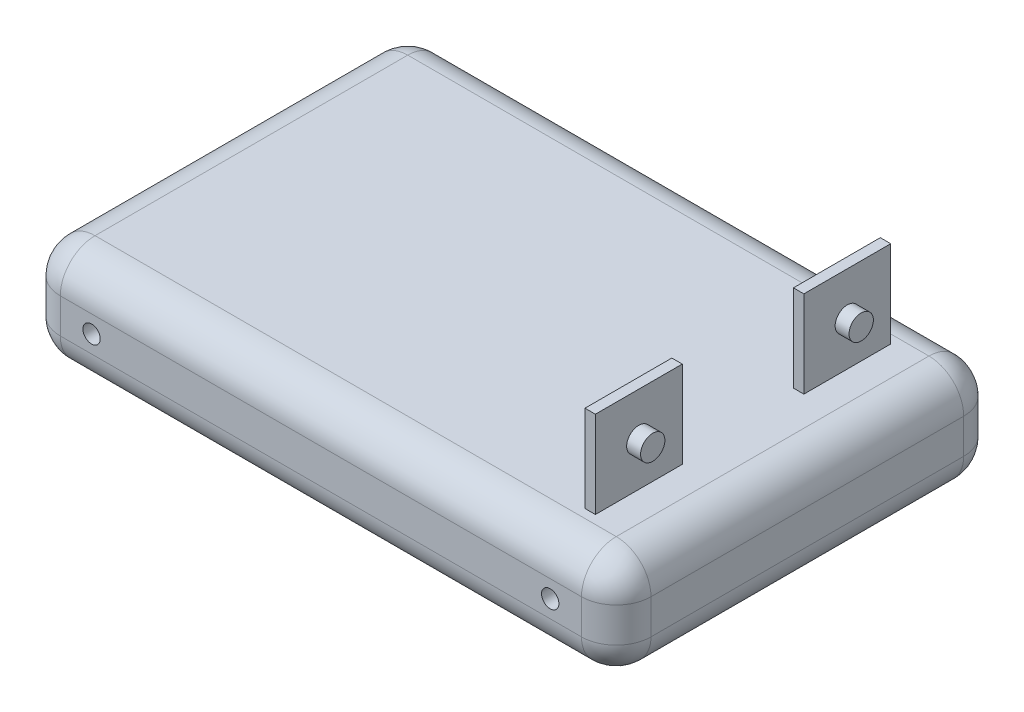
ISO-10303-21;
HEADER;
FILE_DESCRIPTION(('STEP AP214'),'2;1');
FILE_NAME('part.step','',(''),(''),'','','');
FILE_SCHEMA(('AUTOMOTIVE_DESIGN { 1 0 10303 214 1 1 1 1 }'));
ENDSEC;
DATA;
#1=APPLICATION_CONTEXT('core data for automotive mechanical design processes');
#2=APPLICATION_PROTOCOL_DEFINITION('international standard','automotive_design',2000,#1);
#3=PRODUCT_CONTEXT('',#1,'mechanical');
#4=PRODUCT('Part','Part','',(#3));
#5=PRODUCT_RELATED_PRODUCT_CATEGORY('part','',(#4));
#6=PRODUCT_DEFINITION_FORMATION('','',#4);
#7=PRODUCT_DEFINITION_CONTEXT('part definition',#1,'design');
#8=PRODUCT_DEFINITION('design','',#6,#7);
#9=PRODUCT_DEFINITION_SHAPE('','',#8);
#10=(LENGTH_UNIT() NAMED_UNIT(*) SI_UNIT(.MILLI.,.METRE.));
#11=(NAMED_UNIT(*) PLANE_ANGLE_UNIT() SI_UNIT($,.RADIAN.));
#12=(NAMED_UNIT(*) SI_UNIT($,.STERADIAN.) SOLID_ANGLE_UNIT());
#13=UNCERTAINTY_MEASURE_WITH_UNIT(LENGTH_MEASURE(1.E-05),#10,'distance_accuracy_value','');
#14=(GEOMETRIC_REPRESENTATION_CONTEXT(3) GLOBAL_UNCERTAINTY_ASSIGNED_CONTEXT((#13)) GLOBAL_UNIT_ASSIGNED_CONTEXT((#10,
#11,#12)) REPRESENTATION_CONTEXT('',''));
#15=CARTESIAN_POINT('',(0.,0.,0.));
#16=DIRECTION('',(0.,0.,1.));
#17=DIRECTION('',(1.,0.,0.));
#18=AXIS2_PLACEMENT_3D('',#15,#16,#17);
#19=CARTESIAN_POINT('',(0.,30.,0.));
#20=DIRECTION('',(0.,1.,0.));
#21=DIRECTION('',(0.,0.,1.));
#22=AXIS2_PLACEMENT_3D('',#19,#20,#21);
#23=PLANE('',#22);
#24=DIRECTION('',(1.,0.,0.));
#25=VECTOR('',#24,1.);
#26=CARTESIAN_POINT('',(85.,30.,45.));
#27=LINE('',#26,#25);
#28=CARTESIAN_POINT('',(-75.,30.,45.));
#29=VERTEX_POINT('',#28);
#30=CARTESIAN_POINT('',(75.,30.,45.));
#31=VERTEX_POINT('',#30);
#32=EDGE_CURVE('E273',#29,#31,#27,.T.);
#33=ORIENTED_EDGE('',*,*,#32,.T.);
#34=DIRECTION('',(0.,0.,-1.));
#35=VECTOR('',#34,1.);
#36=CARTESIAN_POINT('',(75.,30.,-55.));
#37=LINE('',#36,#35);
#38=CARTESIAN_POINT('',(75.,30.,-45.));
#39=VERTEX_POINT('',#38);
#40=EDGE_CURVE('E310',#31,#39,#37,.T.);
#41=ORIENTED_EDGE('',*,*,#40,.T.);
#42=DIRECTION('',(-1.,0.,0.));
#43=VECTOR('',#42,1.);
#44=CARTESIAN_POINT('',(-75.,30.,-45.));
#45=LINE('',#44,#43);
#46=CARTESIAN_POINT('',(-75.,30.,-45.));
#47=VERTEX_POINT('',#46);
#48=EDGE_CURVE('E308',#39,#47,#45,.T.);
#49=ORIENTED_EDGE('',*,*,#48,.T.);
#50=DIRECTION('',(0.,0.,1.));
#51=VECTOR('',#50,1.);
#52=CARTESIAN_POINT('',(-75.,30.,55.));
#53=LINE('',#52,#51);
#54=EDGE_CURVE('E271',#47,#29,#53,.T.);
#55=ORIENTED_EDGE('',*,*,#54,.T.);
#56=EDGE_LOOP('',(#33,#41,#49,#55));
#57=FACE_BOUND('',#56,.T.);
#58=DIRECTION('',(-1.,0.,0.));
#59=VECTOR('',#58,1.);
#60=CARTESIAN_POINT('',(63.5,30.,-42.5000000000001));
#61=LINE('',#60,#59);
#62=CARTESIAN_POINT('',(66.5,30.,-42.5000000000001));
#63=VERTEX_POINT('',#62);
#64=CARTESIAN_POINT('',(63.5,30.,-42.5000000000001));
#65=VERTEX_POINT('',#64);
#66=EDGE_CURVE('E201',#63,#65,#61,.T.);
#67=ORIENTED_EDGE('',*,*,#66,.F.);
#68=DIRECTION('',(0.,0.,-1.));
#69=VECTOR('',#68,1.);
#70=CARTESIAN_POINT('',(66.5,30.,-42.5000000000001));
#71=LINE('',#70,#69);
#72=CARTESIAN_POINT('',(66.5,30.,-17.5000000000001));
#73=VERTEX_POINT('',#72);
#74=EDGE_CURVE('E198',#73,#63,#71,.T.);
#75=ORIENTED_EDGE('',*,*,#74,.F.);
#76=DIRECTION('',(1.,0.,0.));
#77=VECTOR('',#76,1.);
#78=CARTESIAN_POINT('',(63.5,30.,-17.5000000000001));
#79=LINE('',#78,#77);
#80=CARTESIAN_POINT('',(63.5,30.,-17.5000000000001));
#81=VERTEX_POINT('',#80);
#82=EDGE_CURVE('E210',#81,#73,#79,.T.);
#83=ORIENTED_EDGE('',*,*,#82,.F.);
#84=DIRECTION('',(0.,0.,1.));
#85=VECTOR('',#84,1.);
#86=CARTESIAN_POINT('',(63.5,30.,-42.5000000000001));
#87=LINE('',#86,#85);
#88=EDGE_CURVE('E218',#65,#81,#87,.T.);
#89=ORIENTED_EDGE('',*,*,#88,.F.);
#90=EDGE_LOOP('',(#67,#75,#83,#89));
#91=FACE_BOUND('',#90,.T.);
#92=DIRECTION('',(-1.,0.,0.));
#93=VECTOR('',#92,1.);
#94=CARTESIAN_POINT('',(63.5,30.,17.5));
#95=LINE('',#94,#93);
#96=CARTESIAN_POINT('',(66.5,30.,17.5));
#97=VERTEX_POINT('',#96);
#98=CARTESIAN_POINT('',(63.5,30.,17.5));
#99=VERTEX_POINT('',#98);
#100=EDGE_CURVE('E901',#97,#99,#95,.T.);
#101=ORIENTED_EDGE('',*,*,#100,.F.);
#102=DIRECTION('',(0.,0.,-1.));
#103=VECTOR('',#102,1.);
#104=CARTESIAN_POINT('',(66.5,30.,42.5));
#105=LINE('',#104,#103);
#106=CARTESIAN_POINT('',(66.5,30.,42.5));
#107=VERTEX_POINT('',#106);
#108=EDGE_CURVE('E196',#107,#97,#105,.T.);
#109=ORIENTED_EDGE('',*,*,#108,.F.);
#110=DIRECTION('',(1.,0.,0.));
#111=VECTOR('',#110,1.);
#112=CARTESIAN_POINT('',(63.5,30.,42.5));
#113=LINE('',#112,#111);
#114=CARTESIAN_POINT('',(63.5,30.,42.5));
#115=VERTEX_POINT('',#114);
#116=EDGE_CURVE('E192',#115,#107,#113,.T.);
#117=ORIENTED_EDGE('',*,*,#116,.F.);
#118=DIRECTION('',(0.,0.,1.));
#119=VECTOR('',#118,1.);
#120=CARTESIAN_POINT('',(63.5,30.,42.5));
#121=LINE('',#120,#119);
#122=EDGE_CURVE('E903',#99,#115,#121,.T.);
#123=ORIENTED_EDGE('',*,*,#122,.F.);
#124=EDGE_LOOP('',(#101,#109,#117,#123));
#125=FACE_BOUND('',#124,.T.);
#126=ADVANCED_FACE('F35',(#57,#91,#125),#23,.T.);
#127=CARTESIAN_POINT('',(85.,30.,-55.));
#128=DIRECTION('',(-1.,0.,0.));
#129=DIRECTION('',(0.,0.,1.));
#130=AXIS2_PLACEMENT_3D('',#127,#128,#129);
#131=PLANE('',#130);
#132=DIRECTION('',(0.,-1.,0.));
#133=VECTOR('',#132,1.);
#134=CARTESIAN_POINT('',(85.,30.,45.));
#135=LINE('',#134,#133);
#136=CARTESIAN_POINT('',(85.,20.,45.));
#137=VERTEX_POINT('',#136);
#138=CARTESIAN_POINT('',(85.,10.,45.));
#139=VERTEX_POINT('',#138);
#140=EDGE_CURVE('E276',#137,#139,#135,.T.);
#141=ORIENTED_EDGE('',*,*,#140,.T.);
#142=DIRECTION('',(0.,0.,-1.));
#143=VECTOR('',#142,1.);
#144=CARTESIAN_POINT('',(85.,10.,-55.));
#145=LINE('',#144,#143);
#146=CARTESIAN_POINT('',(85.,10.,-45.));
#147=VERTEX_POINT('',#146);
#148=EDGE_CURVE('E357',#139,#147,#145,.T.);
#149=ORIENTED_EDGE('',*,*,#148,.T.);
#150=DIRECTION('',(0.,-1.,0.));
#151=VECTOR('',#150,1.);
#152=CARTESIAN_POINT('',(85.,30.,-45.));
#153=LINE('',#152,#151);
#154=CARTESIAN_POINT('',(85.,20.,-45.));
#155=VERTEX_POINT('',#154);
#156=EDGE_CURVE('E312',#147,#155,#153,.F.);
#157=ORIENTED_EDGE('',*,*,#156,.T.);
#158=DIRECTION('',(0.,0.,-1.));
#159=VECTOR('',#158,1.);
#160=CARTESIAN_POINT('',(85.,20.,45.));
#161=LINE('',#160,#159);
#162=EDGE_CURVE('E314',#155,#137,#161,.F.);
#163=ORIENTED_EDGE('',*,*,#162,.T.);
#164=EDGE_LOOP('',(#141,#149,#157,#163));
#165=FACE_BOUND('',#164,.T.);
#166=ADVANCED_FACE('F392',(#165),#131,.F.);
#167=CARTESIAN_POINT('',(-85.,30.,-55.));
#168=DIRECTION('',(0.,0.,1.));
#169=DIRECTION('',(1.,0.,0.));
#170=AXIS2_PLACEMENT_3D('',#167,#168,#169);
#171=PLANE('',#170);
#172=CARTESIAN_POINT('',(66.,15.,-55.));
#173=DIRECTION('',(0.,0.,-1.));
#174=DIRECTION('',(-1.,0.,0.));
#175=AXIS2_PLACEMENT_3D('',#172,#173,#174);
#176=CIRCLE('',#175,2.5);
#177=CARTESIAN_POINT('',(63.5,15.,-55.));
#178=VERTEX_POINT('',#177);
#179=EDGE_CURVE('E246',#178,#178,#176,.T.);
#180=ORIENTED_EDGE('',*,*,#179,.F.);
#181=EDGE_LOOP('',(#180));
#182=FACE_BOUND('',#181,.T.);
#183=CARTESIAN_POINT('',(-66.,15.,-55.));
#184=DIRECTION('',(0.,0.,-1.));
#185=DIRECTION('',(-1.,0.,0.));
#186=AXIS2_PLACEMENT_3D('',#183,#184,#185);
#187=CIRCLE('',#186,2.50000000000001);
#188=CARTESIAN_POINT('',(-68.5,15.,-55.));
#189=VERTEX_POINT('',#188);
#190=EDGE_CURVE('E233',#189,#189,#187,.T.);
#191=ORIENTED_EDGE('',*,*,#190,.F.);
#192=EDGE_LOOP('',(#191));
#193=FACE_BOUND('',#192,.T.);
#194=DIRECTION('',(0.,-1.,0.));
#195=VECTOR('',#194,1.);
#196=CARTESIAN_POINT('',(75.,30.,-55.));
#197=LINE('',#196,#195);
#198=CARTESIAN_POINT('',(75.,20.,-55.));
#199=VERTEX_POINT('',#198);
#200=CARTESIAN_POINT('',(75.,10.,-55.));
#201=VERTEX_POINT('',#200);
#202=EDGE_CURVE('E301',#199,#201,#197,.T.);
#203=ORIENTED_EDGE('',*,*,#202,.T.);
#204=DIRECTION('',(-1.,0.,0.));
#205=VECTOR('',#204,1.);
#206=CARTESIAN_POINT('',(-85.,10.,-55.));
#207=LINE('',#206,#205);
#208=CARTESIAN_POINT('',(-75.,10.,-55.));
#209=VERTEX_POINT('',#208);
#210=EDGE_CURVE('E355',#201,#209,#207,.T.);
#211=ORIENTED_EDGE('',*,*,#210,.T.);
#212=DIRECTION('',(0.,-1.,0.));
#213=VECTOR('',#212,1.);
#214=CARTESIAN_POINT('',(-75.,30.,-55.));
#215=LINE('',#214,#213);
#216=CARTESIAN_POINT('',(-75.,20.,-55.));
#217=VERTEX_POINT('',#216);
#218=EDGE_CURVE('E304',#209,#217,#215,.F.);
#219=ORIENTED_EDGE('',*,*,#218,.T.);
#220=DIRECTION('',(-1.,0.,0.));
#221=VECTOR('',#220,1.);
#222=CARTESIAN_POINT('',(85.,20.,-55.));
#223=LINE('',#222,#221);
#224=EDGE_CURVE('E299',#217,#199,#223,.F.);
#225=ORIENTED_EDGE('',*,*,#224,.T.);
#226=EDGE_LOOP('',(#203,#211,#219,#225));
#227=FACE_BOUND('',#226,.T.);
#228=ADVANCED_FACE('F400',(#182,#193,#227),#171,.F.);
#229=CARTESIAN_POINT('',(-85.,30.,-55.));
#230=DIRECTION('',(1.,0.,0.));
#231=DIRECTION('',(0.,0.,-1.));
#232=AXIS2_PLACEMENT_3D('',#229,#230,#231);
#233=PLANE('',#232);
#234=DIRECTION('',(0.,-1.,0.));
#235=VECTOR('',#234,1.);
#236=CARTESIAN_POINT('',(-85.,30.,-45.));
#237=LINE('',#236,#235);
#238=CARTESIAN_POINT('',(-85.,20.,-45.));
#239=VERTEX_POINT('',#238);
#240=CARTESIAN_POINT('',(-85.,10.,-45.));
#241=VERTEX_POINT('',#240);
#242=EDGE_CURVE('E296',#239,#241,#237,.T.);
#243=ORIENTED_EDGE('',*,*,#242,.T.);
#244=DIRECTION('',(0.,0.,1.));
#245=VECTOR('',#244,1.);
#246=CARTESIAN_POINT('',(-85.,10.,-55.));
#247=LINE('',#246,#245);
#248=CARTESIAN_POINT('',(-85.,10.,45.));
#249=VERTEX_POINT('',#248);
#250=EDGE_CURVE('E343',#241,#249,#247,.T.);
#251=ORIENTED_EDGE('',*,*,#250,.T.);
#252=DIRECTION('',(0.,-1.,0.));
#253=VECTOR('',#252,1.);
#254=CARTESIAN_POINT('',(-85.,30.,45.));
#255=LINE('',#254,#253);
#256=CARTESIAN_POINT('',(-85.,20.,45.));
#257=VERTEX_POINT('',#256);
#258=EDGE_CURVE('E269',#249,#257,#255,.F.);
#259=ORIENTED_EDGE('',*,*,#258,.T.);
#260=DIRECTION('',(0.,0.,1.));
#261=VECTOR('',#260,1.);
#262=CARTESIAN_POINT('',(-85.,20.,-55.));
#263=LINE('',#262,#261);
#264=EDGE_CURVE('E266',#257,#239,#263,.F.);
#265=ORIENTED_EDGE('',*,*,#264,.T.);
#266=EDGE_LOOP('',(#243,#251,#259,#265));
#267=FACE_BOUND('',#266,.T.);
#268=ADVANCED_FACE('F416',(#267),#233,.F.);
#269=CARTESIAN_POINT('',(-85.,30.,55.));
#270=DIRECTION('',(0.,0.,-1.));
#271=DIRECTION('',(-1.,0.,0.));
#272=AXIS2_PLACEMENT_3D('',#269,#270,#271);
#273=PLANE('',#272);
#274=CARTESIAN_POINT('',(-66.,15.,55.));
#275=DIRECTION('',(0.,0.,1.));
#276=DIRECTION('',(1.,0.,0.));
#277=AXIS2_PLACEMENT_3D('',#274,#275,#276);
#278=CIRCLE('',#277,2.50000000000001);
#279=CARTESIAN_POINT('',(-63.5,15.,55.));
#280=VERTEX_POINT('',#279);
#281=EDGE_CURVE('E234',#280,#280,#278,.T.);
#282=ORIENTED_EDGE('',*,*,#281,.F.);
#283=EDGE_LOOP('',(#282));
#284=FACE_BOUND('',#283,.T.);
#285=CARTESIAN_POINT('',(66.,15.,55.));
#286=DIRECTION('',(0.,0.,1.));
#287=DIRECTION('',(1.,0.,0.));
#288=AXIS2_PLACEMENT_3D('',#285,#286,#287);
#289=CIRCLE('',#288,2.5);
#290=CARTESIAN_POINT('',(68.5,15.,55.));
#291=VERTEX_POINT('',#290);
#292=EDGE_CURVE('E229',#291,#291,#289,.T.);
#293=ORIENTED_EDGE('',*,*,#292,.F.);
#294=EDGE_LOOP('',(#293));
#295=FACE_BOUND('',#294,.T.);
#296=DIRECTION('',(1.,0.,0.));
#297=VECTOR('',#296,1.);
#298=CARTESIAN_POINT('',(-85.,20.,55.));
#299=LINE('',#298,#297);
#300=CARTESIAN_POINT('',(75.,20.,55.));
#301=VERTEX_POINT('',#300);
#302=CARTESIAN_POINT('',(-75.,20.,55.));
#303=VERTEX_POINT('',#302);
#304=EDGE_CURVE('E261',#301,#303,#299,.F.);
#305=ORIENTED_EDGE('',*,*,#304,.T.);
#306=DIRECTION('',(0.,-1.,0.));
#307=VECTOR('',#306,1.);
#308=CARTESIAN_POINT('',(-75.,30.,55.));
#309=LINE('',#308,#307);
#310=CARTESIAN_POINT('',(-75.,10.,55.));
#311=VERTEX_POINT('',#310);
#312=EDGE_CURVE('E263',#303,#311,#309,.T.);
#313=ORIENTED_EDGE('',*,*,#312,.T.);
#314=DIRECTION('',(1.,0.,0.));
#315=VECTOR('',#314,1.);
#316=CARTESIAN_POINT('',(-85.,10.,55.));
#317=LINE('',#316,#315);
#318=CARTESIAN_POINT('',(75.,10.,55.));
#319=VERTEX_POINT('',#318);
#320=EDGE_CURVE('E254',#311,#319,#317,.T.);
#321=ORIENTED_EDGE('',*,*,#320,.T.);
#322=DIRECTION('',(0.,-1.,0.));
#323=VECTOR('',#322,1.);
#324=CARTESIAN_POINT('',(75.,30.,55.));
#325=LINE('',#324,#323);
#326=EDGE_CURVE('E257',#319,#301,#325,.F.);
#327=ORIENTED_EDGE('',*,*,#326,.T.);
#328=EDGE_LOOP('',(#305,#313,#321,#327));
#329=FACE_BOUND('',#328,.T.);
#330=ADVANCED_FACE('F412',(#284,#295,#329),#273,.F.);
#331=CARTESIAN_POINT('',(0.,0.,0.));
#332=DIRECTION('',(0.,1.,0.));
#333=DIRECTION('',(0.,0.,1.));
#334=AXIS2_PLACEMENT_3D('',#331,#332,#333);
#335=PLANE('',#334);
#336=DIRECTION('',(1.,0.,0.));
#337=VECTOR('',#336,1.);
#338=CARTESIAN_POINT('',(0.,0.,45.));
#339=LINE('',#338,#337);
#340=CARTESIAN_POINT('',(75.,0.,45.));
#341=VERTEX_POINT('',#340);
#342=CARTESIAN_POINT('',(-75.,0.,45.));
#343=VERTEX_POINT('',#342);
#344=EDGE_CURVE('E279',#341,#343,#339,.F.);
#345=ORIENTED_EDGE('',*,*,#344,.T.);
#346=DIRECTION('',(0.,0.,1.));
#347=VECTOR('',#346,1.);
#348=CARTESIAN_POINT('',(-75.,0.,0.));
#349=LINE('',#348,#347);
#350=CARTESIAN_POINT('',(-75.,0.,-45.));
#351=VERTEX_POINT('',#350);
#352=EDGE_CURVE('E349',#343,#351,#349,.F.);
#353=ORIENTED_EDGE('',*,*,#352,.T.);
#354=DIRECTION('',(-1.,0.,0.));
#355=VECTOR('',#354,1.);
#356=CARTESIAN_POINT('',(0.,0.,-45.));
#357=LINE('',#356,#355);
#358=CARTESIAN_POINT('',(75.,0.,-45.));
#359=VERTEX_POINT('',#358);
#360=EDGE_CURVE('E347',#351,#359,#357,.F.);
#361=ORIENTED_EDGE('',*,*,#360,.T.);
#362=DIRECTION('',(0.,0.,-1.));
#363=VECTOR('',#362,1.);
#364=CARTESIAN_POINT('',(75.,0.,0.));
#365=LINE('',#364,#363);
#366=EDGE_CURVE('E345',#359,#341,#365,.F.);
#367=ORIENTED_EDGE('',*,*,#366,.T.);
#368=EDGE_LOOP('',(#345,#353,#361,#367));
#369=FACE_BOUND('',#368,.T.);
#370=ADVANCED_FACE('F408',(#369),#335,.F.);
#371=CARTESIAN_POINT('',(-75.,20.,0.));
#372=DIRECTION('',(0.,0.,-1.));
#373=DIRECTION('',(-1.,0.,0.));
#374=AXIS2_PLACEMENT_3D('',#371,#372,#373);
#375=CYLINDRICAL_SURFACE('',#374,10.);
#376=ORIENTED_EDGE('',*,*,#54,.F.);
#377=CARTESIAN_POINT('',(-75.,20.,-45.));
#378=DIRECTION('',(0.,0.,-1.));
#379=DIRECTION('',(-1.,0.,0.));
#380=AXIS2_PLACEMENT_3D('',#377,#378,#379);
#381=CIRCLE('',#380,10.);
#382=EDGE_CURVE('E306',#47,#239,#381,.F.);
#383=ORIENTED_EDGE('',*,*,#382,.T.);
#384=ORIENTED_EDGE('',*,*,#264,.F.);
#385=CARTESIAN_POINT('',(-75.,20.,45.));
#386=DIRECTION('',(0.,0.,1.));
#387=DIRECTION('',(1.,0.,0.));
#388=AXIS2_PLACEMENT_3D('',#385,#386,#387);
#389=CIRCLE('',#388,10.);
#390=EDGE_CURVE('E258',#29,#257,#389,.T.);
#391=ORIENTED_EDGE('',*,*,#390,.F.);
#392=EDGE_LOOP('',(#376,#383,#384,#391));
#393=FACE_BOUND('',#392,.T.);
#394=ADVANCED_FACE('F411',(#393),#375,.T.);
#395=CARTESIAN_POINT('',(0.,20.,45.));
#396=DIRECTION('',(-1.,0.,0.));
#397=DIRECTION('',(0.,0.,1.));
#398=AXIS2_PLACEMENT_3D('',#395,#396,#397);
#399=CYLINDRICAL_SURFACE('',#398,10.);
#400=ORIENTED_EDGE('',*,*,#304,.F.);
#401=CARTESIAN_POINT('',(75.,20.,45.));
#402=DIRECTION('',(-1.,0.,0.));
#403=DIRECTION('',(0.,0.,1.));
#404=AXIS2_PLACEMENT_3D('',#401,#402,#403);
#405=CIRCLE('',#404,10.);
#406=EDGE_CURVE('E294',#301,#31,#405,.T.);
#407=ORIENTED_EDGE('',*,*,#406,.T.);
#408=ORIENTED_EDGE('',*,*,#32,.F.);
#409=CARTESIAN_POINT('',(-75.,20.,45.));
#410=DIRECTION('',(-1.,0.,0.));
#411=DIRECTION('',(0.,0.,1.));
#412=AXIS2_PLACEMENT_3D('',#409,#410,#411);
#413=CIRCLE('',#412,10.);
#414=EDGE_CURVE('E286',#303,#29,#413,.T.);
#415=ORIENTED_EDGE('',*,*,#414,.F.);
#416=EDGE_LOOP('',(#400,#407,#408,#415));
#417=FACE_BOUND('',#416,.T.);
#418=ADVANCED_FACE('F440',(#417),#399,.T.);
#419=CARTESIAN_POINT('',(75.,30.,45.));
#420=DIRECTION('',(0.,-1.,0.));
#421=DIRECTION('',(0.,0.,-1.));
#422=AXIS2_PLACEMENT_3D('',#419,#420,#421);
#423=CYLINDRICAL_SURFACE('',#422,10.);
#424=ORIENTED_EDGE('',*,*,#326,.F.);
#425=CARTESIAN_POINT('',(75.,10.,45.));
#426=DIRECTION('',(0.,-1.,0.));
#427=DIRECTION('',(0.,0.,-1.));
#428=AXIS2_PLACEMENT_3D('',#425,#426,#427);
#429=CIRCLE('',#428,10.);
#430=EDGE_CURVE('E339',#319,#139,#429,.F.);
#431=ORIENTED_EDGE('',*,*,#430,.T.);
#432=ORIENTED_EDGE('',*,*,#140,.F.);
#433=CARTESIAN_POINT('',(75.,20.,45.));
#434=DIRECTION('',(0.,-1.,0.));
#435=DIRECTION('',(0.,0.,-1.));
#436=AXIS2_PLACEMENT_3D('',#433,#434,#435);
#437=CIRCLE('',#436,10.);
#438=EDGE_CURVE('E282',#137,#301,#437,.T.);
#439=ORIENTED_EDGE('',*,*,#438,.T.);
#440=EDGE_LOOP('',(#424,#431,#432,#439));
#441=FACE_BOUND('',#440,.T.);
#442=ADVANCED_FACE('F436',(#441),#423,.T.);
#443=CARTESIAN_POINT('',(-75.,20.,45.));
#444=DIRECTION('',(0.,1.,0.));
#445=DIRECTION('',(0.,0.,1.));
#446=AXIS2_PLACEMENT_3D('',#443,#444,#445);
#447=SPHERICAL_SURFACE('',#446,10.);
#448=ORIENTED_EDGE('',*,*,#414,.T.);
#449=ORIENTED_EDGE('',*,*,#390,.T.);
#450=CARTESIAN_POINT('',(-75.,20.,45.));
#451=DIRECTION('',(0.,1.,0.));
#452=DIRECTION('',(0.,0.,1.));
#453=AXIS2_PLACEMENT_3D('',#450,#451,#452);
#454=CIRCLE('',#453,10.);
#455=EDGE_CURVE('E283',#303,#257,#454,.F.);
#456=ORIENTED_EDGE('',*,*,#455,.F.);
#457=EDGE_LOOP('',(#448,#449,#456));
#458=FACE_BOUND('',#457,.T.);
#459=ADVANCED_FACE('F432',(#458),#447,.T.);
#460=CARTESIAN_POINT('',(-85.,10.,45.));
#461=DIRECTION('',(1.,0.,0.));
#462=DIRECTION('',(0.,0.,-1.));
#463=AXIS2_PLACEMENT_3D('',#460,#461,#462);
#464=CYLINDRICAL_SURFACE('',#463,10.);
#465=ORIENTED_EDGE('',*,*,#344,.F.);
#466=CARTESIAN_POINT('',(75.,10.,45.));
#467=DIRECTION('',(1.,0.,0.));
#468=DIRECTION('',(0.,0.,-1.));
#469=AXIS2_PLACEMENT_3D('',#466,#467,#468);
#470=CIRCLE('',#469,10.);
#471=EDGE_CURVE('E336',#341,#319,#470,.F.);
#472=ORIENTED_EDGE('',*,*,#471,.T.);
#473=ORIENTED_EDGE('',*,*,#320,.F.);
#474=CARTESIAN_POINT('',(-75.,10.,45.));
#475=DIRECTION('',(1.,0.,0.));
#476=DIRECTION('',(0.,0.,-1.));
#477=AXIS2_PLACEMENT_3D('',#474,#475,#476);
#478=CIRCLE('',#477,10.);
#479=EDGE_CURVE('E316',#311,#343,#478,.T.);
#480=ORIENTED_EDGE('',*,*,#479,.T.);
#481=EDGE_LOOP('',(#465,#472,#473,#480));
#482=FACE_BOUND('',#481,.T.);
#483=ADVANCED_FACE('F428',(#482),#464,.T.);
#484=CARTESIAN_POINT('',(-75.,30.,45.));
#485=DIRECTION('',(0.,-1.,0.));
#486=DIRECTION('',(0.,0.,-1.));
#487=AXIS2_PLACEMENT_3D('',#484,#485,#486);
#488=CYLINDRICAL_SURFACE('',#487,10.);
#489=ORIENTED_EDGE('',*,*,#258,.F.);
#490=CARTESIAN_POINT('',(-75.,10.,45.));
#491=DIRECTION('',(0.,-1.,0.));
#492=DIRECTION('',(0.,0.,-1.));
#493=AXIS2_PLACEMENT_3D('',#490,#491,#492);
#494=CIRCLE('',#493,10.);
#495=EDGE_CURVE('E341',#249,#311,#494,.F.);
#496=ORIENTED_EDGE('',*,*,#495,.T.);
#497=ORIENTED_EDGE('',*,*,#312,.F.);
#498=ORIENTED_EDGE('',*,*,#455,.T.);
#499=EDGE_LOOP('',(#489,#496,#497,#498));
#500=FACE_BOUND('',#499,.T.);
#501=ADVANCED_FACE('F424',(#500),#488,.T.);
#502=CARTESIAN_POINT('',(-75.,30.,-45.));
#503=DIRECTION('',(0.,-1.,0.));
#504=DIRECTION('',(0.,0.,-1.));
#505=AXIS2_PLACEMENT_3D('',#502,#503,#504);
#506=CYLINDRICAL_SURFACE('',#505,10.);
#507=ORIENTED_EDGE('',*,*,#218,.F.);
#508=CARTESIAN_POINT('',(-75.,10.,-45.));
#509=DIRECTION('',(0.,-1.,0.));
#510=DIRECTION('',(0.,0.,-1.));
#511=AXIS2_PLACEMENT_3D('',#508,#509,#510);
#512=CIRCLE('',#511,10.);
#513=EDGE_CURVE('E351',#209,#241,#512,.F.);
#514=ORIENTED_EDGE('',*,*,#513,.T.);
#515=ORIENTED_EDGE('',*,*,#242,.F.);
#516=CARTESIAN_POINT('',(-75.,20.,-45.));
#517=DIRECTION('',(0.,1.,0.));
#518=DIRECTION('',(0.,0.,1.));
#519=AXIS2_PLACEMENT_3D('',#516,#517,#518);
#520=CIRCLE('',#519,10.);
#521=EDGE_CURVE('E287',#217,#239,#520,.T.);
#522=ORIENTED_EDGE('',*,*,#521,.F.);
#523=EDGE_LOOP('',(#507,#514,#515,#522));
#524=FACE_BOUND('',#523,.T.);
#525=ADVANCED_FACE('F427',(#524),#506,.T.);
#526=CARTESIAN_POINT('',(-75.,20.,-45.));
#527=DIRECTION('',(0.,0.,1.));
#528=DIRECTION('',(1.,0.,0.));
#529=AXIS2_PLACEMENT_3D('',#526,#527,#528);
#530=SPHERICAL_SURFACE('',#529,10.);
#531=ORIENTED_EDGE('',*,*,#521,.T.);
#532=ORIENTED_EDGE('',*,*,#382,.F.);
#533=CARTESIAN_POINT('',(-75.,20.,-45.));
#534=DIRECTION('',(1.,0.,0.));
#535=DIRECTION('',(0.,0.,-1.));
#536=AXIS2_PLACEMENT_3D('',#533,#534,#535);
#537=CIRCLE('',#536,10.);
#538=EDGE_CURVE('E330',#217,#47,#537,.T.);
#539=ORIENTED_EDGE('',*,*,#538,.F.);
#540=EDGE_LOOP('',(#531,#532,#539));
#541=FACE_BOUND('',#540,.T.);
#542=ADVANCED_FACE('F467',(#541),#530,.T.);
#543=CARTESIAN_POINT('',(0.,20.,-45.));
#544=DIRECTION('',(1.,0.,0.));
#545=DIRECTION('',(0.,0.,-1.));
#546=AXIS2_PLACEMENT_3D('',#543,#544,#545);
#547=CYLINDRICAL_SURFACE('',#546,10.);
#548=ORIENTED_EDGE('',*,*,#538,.T.);
#549=ORIENTED_EDGE('',*,*,#48,.F.);
#550=CARTESIAN_POINT('',(75.,20.,-45.));
#551=DIRECTION('',(1.,0.,0.));
#552=DIRECTION('',(0.,1.,0.));
#553=AXIS2_PLACEMENT_3D('',#550,#551,#552);
#554=CIRCLE('',#553,10.);
#555=EDGE_CURVE('E327',#199,#39,#554,.T.);
#556=ORIENTED_EDGE('',*,*,#555,.F.);
#557=ORIENTED_EDGE('',*,*,#224,.F.);
#558=EDGE_LOOP('',(#548,#549,#556,#557));
#559=FACE_BOUND('',#558,.T.);
#560=ADVANCED_FACE('F463',(#559),#547,.T.);
#561=CARTESIAN_POINT('',(75.,30.,-45.));
#562=DIRECTION('',(0.,-1.,0.));
#563=DIRECTION('',(0.,0.,-1.));
#564=AXIS2_PLACEMENT_3D('',#561,#562,#563);
#565=CYLINDRICAL_SURFACE('',#564,10.);
#566=ORIENTED_EDGE('',*,*,#156,.F.);
#567=CARTESIAN_POINT('',(75.,10.,-45.));
#568=DIRECTION('',(0.,-1.,0.));
#569=DIRECTION('',(0.,0.,-1.));
#570=AXIS2_PLACEMENT_3D('',#567,#568,#569);
#571=CIRCLE('',#570,10.);
#572=EDGE_CURVE('E353',#147,#201,#571,.F.);
#573=ORIENTED_EDGE('',*,*,#572,.T.);
#574=ORIENTED_EDGE('',*,*,#202,.F.);
#575=CARTESIAN_POINT('',(75.,20.,-45.));
#576=DIRECTION('',(0.,1.,0.));
#577=DIRECTION('',(0.,0.,1.));
#578=AXIS2_PLACEMENT_3D('',#575,#576,#577);
#579=CIRCLE('',#578,10.);
#580=EDGE_CURVE('E324',#155,#199,#579,.T.);
#581=ORIENTED_EDGE('',*,*,#580,.F.);
#582=EDGE_LOOP('',(#566,#573,#574,#581));
#583=FACE_BOUND('',#582,.T.);
#584=ADVANCED_FACE('F459',(#583),#565,.T.);
#585=CARTESIAN_POINT('',(75.,20.,-45.));
#586=DIRECTION('',(0.,0.,-1.));
#587=DIRECTION('',(-1.,0.,0.));
#588=AXIS2_PLACEMENT_3D('',#585,#586,#587);
#589=SPHERICAL_SURFACE('',#588,10.);
#590=ORIENTED_EDGE('',*,*,#580,.T.);
#591=ORIENTED_EDGE('',*,*,#555,.T.);
#592=CARTESIAN_POINT('',(75.,20.,-45.));
#593=DIRECTION('',(0.,0.,-1.));
#594=DIRECTION('',(-1.,0.,0.));
#595=AXIS2_PLACEMENT_3D('',#592,#593,#594);
#596=CIRCLE('',#595,10.);
#597=EDGE_CURVE('E320',#155,#39,#596,.F.);
#598=ORIENTED_EDGE('',*,*,#597,.F.);
#599=EDGE_LOOP('',(#590,#591,#598));
#600=FACE_BOUND('',#599,.T.);
#601=ADVANCED_FACE('F455',(#600),#589,.T.);
#602=CARTESIAN_POINT('',(75.,20.,0.));
#603=DIRECTION('',(0.,0.,1.));
#604=DIRECTION('',(1.,0.,0.));
#605=AXIS2_PLACEMENT_3D('',#602,#603,#604);
#606=CYLINDRICAL_SURFACE('',#605,10.);
#607=ORIENTED_EDGE('',*,*,#597,.T.);
#608=ORIENTED_EDGE('',*,*,#40,.F.);
#609=CARTESIAN_POINT('',(75.,20.,45.));
#610=DIRECTION('',(0.,0.,1.));
#611=DIRECTION('',(0.,-1.,0.));
#612=AXIS2_PLACEMENT_3D('',#609,#610,#611);
#613=CIRCLE('',#612,10.);
#614=EDGE_CURVE('E317',#137,#31,#613,.T.);
#615=ORIENTED_EDGE('',*,*,#614,.F.);
#616=ORIENTED_EDGE('',*,*,#162,.F.);
#617=EDGE_LOOP('',(#607,#608,#615,#616));
#618=FACE_BOUND('',#617,.T.);
#619=ADVANCED_FACE('F451',(#618),#606,.T.);
#620=CARTESIAN_POINT('',(75.,20.,45.));
#621=DIRECTION('',(0.,0.,1.));
#622=DIRECTION('',(1.,0.,0.));
#623=AXIS2_PLACEMENT_3D('',#620,#621,#622);
#624=SPHERICAL_SURFACE('',#623,10.);
#625=ORIENTED_EDGE('',*,*,#614,.T.);
#626=ORIENTED_EDGE('',*,*,#406,.F.);
#627=ORIENTED_EDGE('',*,*,#438,.F.);
#628=EDGE_LOOP('',(#625,#626,#627));
#629=FACE_BOUND('',#628,.T.);
#630=ADVANCED_FACE('F448',(#629),#624,.T.);
#631=CARTESIAN_POINT('',(-75.,10.,45.));
#632=DIRECTION('',(0.,0.,1.));
#633=DIRECTION('',(1.,0.,0.));
#634=AXIS2_PLACEMENT_3D('',#631,#632,#633);
#635=SPHERICAL_SURFACE('',#634,10.);
#636=ORIENTED_EDGE('',*,*,#479,.F.);
#637=ORIENTED_EDGE('',*,*,#495,.F.);
#638=CARTESIAN_POINT('',(-75.,10.,45.));
#639=DIRECTION('',(0.,0.,-1.));
#640=DIRECTION('',(-1.,0.,0.));
#641=AXIS2_PLACEMENT_3D('',#638,#639,#640);
#642=CIRCLE('',#641,10.);
#643=EDGE_CURVE('E321',#343,#249,#642,.T.);
#644=ORIENTED_EDGE('',*,*,#643,.F.);
#645=EDGE_LOOP('',(#636,#637,#644));
#646=FACE_BOUND('',#645,.T.);
#647=ADVANCED_FACE('F37',(#646),#635,.T.);
#648=CARTESIAN_POINT('',(-75.,10.,-55.));
#649=DIRECTION('',(0.,0.,1.));
#650=DIRECTION('',(1.,0.,0.));
#651=AXIS2_PLACEMENT_3D('',#648,#649,#650);
#652=CYLINDRICAL_SURFACE('',#651,10.);
#653=ORIENTED_EDGE('',*,*,#643,.T.);
#654=ORIENTED_EDGE('',*,*,#250,.F.);
#655=CARTESIAN_POINT('',(-75.,10.,-45.));
#656=DIRECTION('',(0.,0.,-1.));
#657=DIRECTION('',(-1.,0.,0.));
#658=AXIS2_PLACEMENT_3D('',#655,#656,#657);
#659=CIRCLE('',#658,10.);
#660=EDGE_CURVE('E370',#351,#241,#659,.T.);
#661=ORIENTED_EDGE('',*,*,#660,.F.);
#662=ORIENTED_EDGE('',*,*,#352,.F.);
#663=EDGE_LOOP('',(#653,#654,#661,#662));
#664=FACE_BOUND('',#663,.T.);
#665=ADVANCED_FACE('F493',(#664),#652,.T.);
#666=CARTESIAN_POINT('',(-75.,10.,-45.));
#667=DIRECTION('',(0.,1.,0.));
#668=DIRECTION('',(0.,0.,1.));
#669=AXIS2_PLACEMENT_3D('',#666,#667,#668);
#670=SPHERICAL_SURFACE('',#669,10.);
#671=ORIENTED_EDGE('',*,*,#660,.T.);
#672=ORIENTED_EDGE('',*,*,#513,.F.);
#673=CARTESIAN_POINT('',(-75.,10.,-45.));
#674=DIRECTION('',(1.,0.,0.));
#675=DIRECTION('',(0.,0.,-1.));
#676=AXIS2_PLACEMENT_3D('',#673,#674,#675);
#677=CIRCLE('',#676,10.);
#678=EDGE_CURVE('E367',#351,#209,#677,.T.);
#679=ORIENTED_EDGE('',*,*,#678,.F.);
#680=EDGE_LOOP('',(#671,#672,#679));
#681=FACE_BOUND('',#680,.T.);
#682=ADVANCED_FACE('F490',(#681),#670,.T.);
#683=CARTESIAN_POINT('',(-85.,10.,-45.));
#684=DIRECTION('',(-1.,0.,0.));
#685=DIRECTION('',(0.,0.,1.));
#686=AXIS2_PLACEMENT_3D('',#683,#684,#685);
#687=CYLINDRICAL_SURFACE('',#686,10.);
#688=ORIENTED_EDGE('',*,*,#678,.T.);
#689=ORIENTED_EDGE('',*,*,#210,.F.);
#690=CARTESIAN_POINT('',(75.,10.,-45.));
#691=DIRECTION('',(1.,0.,0.));
#692=DIRECTION('',(0.,0.,-1.));
#693=AXIS2_PLACEMENT_3D('',#690,#691,#692);
#694=CIRCLE('',#693,10.);
#695=EDGE_CURVE('E364',#359,#201,#694,.T.);
#696=ORIENTED_EDGE('',*,*,#695,.F.);
#697=ORIENTED_EDGE('',*,*,#360,.F.);
#698=EDGE_LOOP('',(#688,#689,#696,#697));
#699=FACE_BOUND('',#698,.T.);
#700=ADVANCED_FACE('F486',(#699),#687,.T.);
#701=CARTESIAN_POINT('',(75.,10.,-45.));
#702=DIRECTION('',(0.,1.,0.));
#703=DIRECTION('',(0.,0.,1.));
#704=AXIS2_PLACEMENT_3D('',#701,#702,#703);
#705=SPHERICAL_SURFACE('',#704,10.);
#706=ORIENTED_EDGE('',*,*,#695,.T.);
#707=ORIENTED_EDGE('',*,*,#572,.F.);
#708=CARTESIAN_POINT('',(75.,10.,-45.));
#709=DIRECTION('',(0.,0.,1.));
#710=DIRECTION('',(1.,0.,0.));
#711=AXIS2_PLACEMENT_3D('',#708,#709,#710);
#712=CIRCLE('',#711,10.);
#713=EDGE_CURVE('E361',#359,#147,#712,.T.);
#714=ORIENTED_EDGE('',*,*,#713,.F.);
#715=EDGE_LOOP('',(#706,#707,#714));
#716=FACE_BOUND('',#715,.T.);
#717=ADVANCED_FACE('F482',(#716),#705,.T.);
#718=CARTESIAN_POINT('',(75.,10.,-55.));
#719=DIRECTION('',(0.,0.,-1.));
#720=DIRECTION('',(-1.,0.,0.));
#721=AXIS2_PLACEMENT_3D('',#718,#719,#720);
#722=CYLINDRICAL_SURFACE('',#721,10.);
#723=ORIENTED_EDGE('',*,*,#713,.T.);
#724=ORIENTED_EDGE('',*,*,#148,.F.);
#725=CARTESIAN_POINT('',(75.,10.,45.));
#726=DIRECTION('',(0.,0.,1.));
#727=DIRECTION('',(1.,0.,0.));
#728=AXIS2_PLACEMENT_3D('',#725,#726,#727);
#729=CIRCLE('',#728,10.);
#730=EDGE_CURVE('E245',#341,#139,#729,.T.);
#731=ORIENTED_EDGE('',*,*,#730,.F.);
#732=ORIENTED_EDGE('',*,*,#366,.F.);
#733=EDGE_LOOP('',(#723,#724,#731,#732));
#734=FACE_BOUND('',#733,.T.);
#735=ADVANCED_FACE('F478',(#734),#722,.T.);
#736=CARTESIAN_POINT('',(75.,10.,45.));
#737=DIRECTION('',(0.,0.,1.));
#738=DIRECTION('',(1.,0.,0.));
#739=AXIS2_PLACEMENT_3D('',#736,#737,#738);
#740=SPHERICAL_SURFACE('',#739,10.);
#741=ORIENTED_EDGE('',*,*,#730,.T.);
#742=ORIENTED_EDGE('',*,*,#430,.F.);
#743=ORIENTED_EDGE('',*,*,#471,.F.);
#744=EDGE_LOOP('',(#741,#742,#743));
#745=FACE_BOUND('',#744,.T.);
#746=ADVANCED_FACE('F475',(#745),#740,.T.);
#747=CARTESIAN_POINT('',(-66.,15.,-50.));
#748=DIRECTION('',(0.,0.,-1.));
#749=DIRECTION('',(-1.,0.,0.));
#750=AXIS2_PLACEMENT_3D('',#747,#748,#749);
#751=CYLINDRICAL_SURFACE('',#750,2.50000000000001);
#752=CARTESIAN_POINT('',(-66.,15.,-50.));
#753=DIRECTION('',(0.,0.,-1.));
#754=DIRECTION('',(-1.,0.,0.));
#755=AXIS2_PLACEMENT_3D('',#752,#753,#754);
#756=CIRCLE('',#755,2.50000000000001);
#757=CARTESIAN_POINT('',(-68.5,15.,-50.));
#758=VERTEX_POINT('',#757);
#759=EDGE_CURVE('E249',#758,#758,#756,.T.);
#760=ORIENTED_EDGE('',*,*,#759,.F.);
#761=EDGE_LOOP('',(#760));
#762=FACE_BOUND('',#761,.T.);
#763=ORIENTED_EDGE('',*,*,#190,.T.);
#764=EDGE_LOOP('',(#763));
#765=FACE_BOUND('',#764,.T.);
#766=ADVANCED_FACE('F406',(#762,#765),#751,.F.);
#767=CARTESIAN_POINT('',(-66.,15.,-50.));
#768=DIRECTION('',(0.,0.,-1.));
#769=DIRECTION('',(-1.,0.,0.));
#770=AXIS2_PLACEMENT_3D('',#767,#768,#769);
#771=PLANE('',#770);
#772=ORIENTED_EDGE('',*,*,#759,.T.);
#773=EDGE_LOOP('',(#772));
#774=FACE_BOUND('',#773,.T.);
#775=ADVANCED_FACE('F712',(#774),#771,.T.);
#776=CARTESIAN_POINT('',(66.,15.,-50.));
#777=DIRECTION('',(0.,0.,-1.));
#778=DIRECTION('',(-1.,0.,0.));
#779=AXIS2_PLACEMENT_3D('',#776,#777,#778);
#780=CYLINDRICAL_SURFACE('',#779,2.5);
#781=CARTESIAN_POINT('',(66.,15.,-50.));
#782=DIRECTION('',(0.,0.,-1.));
#783=DIRECTION('',(-1.,0.,0.));
#784=AXIS2_PLACEMENT_3D('',#781,#782,#783);
#785=CIRCLE('',#784,2.5);
#786=CARTESIAN_POINT('',(63.5,15.,-50.));
#787=VERTEX_POINT('',#786);
#788=EDGE_CURVE('E242',#787,#787,#785,.T.);
#789=ORIENTED_EDGE('',*,*,#788,.F.);
#790=EDGE_LOOP('',(#789));
#791=FACE_BOUND('',#790,.T.);
#792=ORIENTED_EDGE('',*,*,#179,.T.);
#793=EDGE_LOOP('',(#792));
#794=FACE_BOUND('',#793,.T.);
#795=ADVANCED_FACE('F720',(#791,#794),#780,.F.);
#796=CARTESIAN_POINT('',(66.,15.,-50.));
#797=DIRECTION('',(0.,0.,-1.));
#798=DIRECTION('',(-1.,0.,0.));
#799=AXIS2_PLACEMENT_3D('',#796,#797,#798);
#800=PLANE('',#799);
#801=ORIENTED_EDGE('',*,*,#788,.T.);
#802=EDGE_LOOP('',(#801));
#803=FACE_BOUND('',#802,.T.);
#804=ADVANCED_FACE('F728',(#803),#800,.T.);
#805=CARTESIAN_POINT('',(66.,15.,50.));
#806=DIRECTION('',(0.,0.,1.));
#807=DIRECTION('',(1.,0.,0.));
#808=AXIS2_PLACEMENT_3D('',#805,#806,#807);
#809=CYLINDRICAL_SURFACE('',#808,2.5);
#810=CARTESIAN_POINT('',(66.,15.,50.));
#811=DIRECTION('',(0.,0.,1.));
#812=DIRECTION('',(1.,0.,0.));
#813=AXIS2_PLACEMENT_3D('',#810,#811,#812);
#814=CIRCLE('',#813,2.5);
#815=CARTESIAN_POINT('',(68.5,15.,50.));
#816=VERTEX_POINT('',#815);
#817=EDGE_CURVE('E237',#816,#816,#814,.T.);
#818=ORIENTED_EDGE('',*,*,#817,.F.);
#819=EDGE_LOOP('',(#818));
#820=FACE_BOUND('',#819,.T.);
#821=ORIENTED_EDGE('',*,*,#292,.T.);
#822=EDGE_LOOP('',(#821));
#823=FACE_BOUND('',#822,.T.);
#824=ADVANCED_FACE('F736',(#820,#823),#809,.F.);
#825=CARTESIAN_POINT('',(66.,15.,50.));
#826=DIRECTION('',(0.,0.,1.));
#827=DIRECTION('',(1.,0.,0.));
#828=AXIS2_PLACEMENT_3D('',#825,#826,#827);
#829=PLANE('',#828);
#830=ORIENTED_EDGE('',*,*,#817,.T.);
#831=EDGE_LOOP('',(#830));
#832=FACE_BOUND('',#831,.T.);
#833=ADVANCED_FACE('F744',(#832),#829,.T.);
#834=CARTESIAN_POINT('',(-66.,15.,50.));
#835=DIRECTION('',(0.,0.,1.));
#836=DIRECTION('',(1.,0.,0.));
#837=AXIS2_PLACEMENT_3D('',#834,#835,#836);
#838=CYLINDRICAL_SURFACE('',#837,2.50000000000001);
#839=CARTESIAN_POINT('',(-66.,15.,50.));
#840=DIRECTION('',(0.,0.,1.));
#841=DIRECTION('',(1.,0.,0.));
#842=AXIS2_PLACEMENT_3D('',#839,#840,#841);
#843=CIRCLE('',#842,2.50000000000001);
#844=CARTESIAN_POINT('',(-63.5,15.,50.));
#845=VERTEX_POINT('',#844);
#846=EDGE_CURVE('E230',#845,#845,#843,.T.);
#847=ORIENTED_EDGE('',*,*,#846,.F.);
#848=EDGE_LOOP('',(#847));
#849=FACE_BOUND('',#848,.T.);
#850=ORIENTED_EDGE('',*,*,#281,.T.);
#851=EDGE_LOOP('',(#850));
#852=FACE_BOUND('',#851,.T.);
#853=ADVANCED_FACE('F753',(#849,#852),#838,.F.);
#854=CARTESIAN_POINT('',(-66.,15.,50.));
#855=DIRECTION('',(0.,0.,1.));
#856=DIRECTION('',(1.,0.,0.));
#857=AXIS2_PLACEMENT_3D('',#854,#855,#856);
#858=PLANE('',#857);
#859=ORIENTED_EDGE('',*,*,#846,.T.);
#860=EDGE_LOOP('',(#859));
#861=FACE_BOUND('',#860,.T.);
#862=ADVANCED_FACE('F762',(#861),#858,.T.);
#863=CARTESIAN_POINT('',(66.5,55.,-42.5000000000001));
#864=DIRECTION('',(-1.,0.,0.));
#865=DIRECTION('',(0.,0.,1.));
#866=AXIS2_PLACEMENT_3D('',#863,#864,#865);
#867=PLANE('',#866);
#868=CARTESIAN_POINT('',(66.5,42.5,-30.0000000000001));
#869=DIRECTION('',(-1.,0.,0.));
#870=DIRECTION('',(0.,0.,1.));
#871=AXIS2_PLACEMENT_3D('',#868,#869,#870);
#872=CIRCLE('',#871,3.49999999999999);
#873=CARTESIAN_POINT('',(66.5,42.5,-26.5000000000001));
#874=VERTEX_POINT('',#873);
#875=EDGE_CURVE('E11',#874,#874,#872,.F.);
#876=ORIENTED_EDGE('',*,*,#875,.F.);
#877=EDGE_LOOP('',(#876));
#878=FACE_BOUND('',#877,.T.);
#879=ORIENTED_EDGE('',*,*,#74,.T.);
#880=DIRECTION('',(0.,-1.,0.));
#881=VECTOR('',#880,1.);
#882=CARTESIAN_POINT('',(66.5,55.,-42.5000000000001));
#883=LINE('',#882,#881);
#884=CARTESIAN_POINT('',(66.5,55.,-42.5000000000001));
#885=VERTEX_POINT('',#884);
#886=EDGE_CURVE('E227',#885,#63,#883,.T.);
#887=ORIENTED_EDGE('',*,*,#886,.F.);
#888=DIRECTION('',(0.,0.,-1.));
#889=VECTOR('',#888,1.);
#890=CARTESIAN_POINT('',(66.5,55.,-42.5000000000001));
#891=LINE('',#890,#889);
#892=CARTESIAN_POINT('',(66.5,55.,-17.5000000000001));
#893=VERTEX_POINT('',#892);
#894=EDGE_CURVE('E206',#893,#885,#891,.T.);
#895=ORIENTED_EDGE('',*,*,#894,.F.);
#896=DIRECTION('',(0.,-1.,0.));
#897=VECTOR('',#896,1.);
#898=CARTESIAN_POINT('',(66.5,55.,-17.5000000000001));
#899=LINE('',#898,#897);
#900=EDGE_CURVE('E215',#893,#73,#899,.T.);
#901=ORIENTED_EDGE('',*,*,#900,.T.);
#902=EDGE_LOOP('',(#879,#887,#895,#901));
#903=FACE_BOUND('',#902,.T.);
#904=ADVANCED_FACE('F770',(#878,#903),#867,.F.);
#905=CARTESIAN_POINT('',(63.5,55.,-42.5000000000001));
#906=DIRECTION('',(0.,0.,1.));
#907=DIRECTION('',(1.,0.,0.));
#908=AXIS2_PLACEMENT_3D('',#905,#906,#907);
#909=PLANE('',#908);
#910=ORIENTED_EDGE('',*,*,#66,.T.);
#911=DIRECTION('',(0.,-1.,0.));
#912=VECTOR('',#911,1.);
#913=CARTESIAN_POINT('',(63.5,55.,-42.5000000000001));
#914=LINE('',#913,#912);
#915=CARTESIAN_POINT('',(63.5,55.,-42.5000000000001));
#916=VERTEX_POINT('',#915);
#917=EDGE_CURVE('E224',#916,#65,#914,.T.);
#918=ORIENTED_EDGE('',*,*,#917,.F.);
#919=DIRECTION('',(-1.,0.,0.));
#920=VECTOR('',#919,1.);
#921=CARTESIAN_POINT('',(63.5,55.,-42.5000000000001));
#922=LINE('',#921,#920);
#923=EDGE_CURVE('E209',#885,#916,#922,.T.);
#924=ORIENTED_EDGE('',*,*,#923,.F.);
#925=ORIENTED_EDGE('',*,*,#886,.T.);
#926=EDGE_LOOP('',(#910,#918,#924,#925));
#927=FACE_BOUND('',#926,.T.);
#928=ADVANCED_FACE('F783',(#927),#909,.F.);
#929=CARTESIAN_POINT('',(63.5,55.,-42.5000000000001));
#930=DIRECTION('',(1.,0.,0.));
#931=DIRECTION('',(0.,0.,-1.));
#932=AXIS2_PLACEMENT_3D('',#929,#930,#931);
#933=PLANE('',#932);
#934=ORIENTED_EDGE('',*,*,#88,.T.);
#935=DIRECTION('',(0.,-1.,0.));
#936=VECTOR('',#935,1.);
#937=CARTESIAN_POINT('',(63.5,55.,-17.5000000000001));
#938=LINE('',#937,#936);
#939=CARTESIAN_POINT('',(63.5,55.,-17.5000000000001));
#940=VERTEX_POINT('',#939);
#941=EDGE_CURVE('E58',#940,#81,#938,.T.);
#942=ORIENTED_EDGE('',*,*,#941,.F.);
#943=DIRECTION('',(0.,0.,1.));
#944=VECTOR('',#943,1.);
#945=CARTESIAN_POINT('',(63.5,55.,-42.5000000000001));
#946=LINE('',#945,#944);
#947=EDGE_CURVE('E212',#916,#940,#946,.T.);
#948=ORIENTED_EDGE('',*,*,#947,.F.);
#949=ORIENTED_EDGE('',*,*,#917,.T.);
#950=EDGE_LOOP('',(#934,#942,#948,#949));
#951=FACE_BOUND('',#950,.T.);
#952=ADVANCED_FACE('F793',(#951),#933,.F.);
#953=CARTESIAN_POINT('',(63.5,55.,-17.5000000000001));
#954=DIRECTION('',(0.,0.,-1.));
#955=DIRECTION('',(-1.,0.,0.));
#956=AXIS2_PLACEMENT_3D('',#953,#954,#955);
#957=PLANE('',#956);
#958=ORIENTED_EDGE('',*,*,#82,.T.);
#959=ORIENTED_EDGE('',*,*,#900,.F.);
#960=DIRECTION('',(1.,0.,0.));
#961=VECTOR('',#960,1.);
#962=CARTESIAN_POINT('',(63.5,55.,-17.5000000000001));
#963=LINE('',#962,#961);
#964=EDGE_CURVE('E214',#940,#893,#963,.T.);
#965=ORIENTED_EDGE('',*,*,#964,.F.);
#966=ORIENTED_EDGE('',*,*,#941,.T.);
#967=EDGE_LOOP('',(#958,#959,#965,#966));
#968=FACE_BOUND('',#967,.T.);
#969=ADVANCED_FACE('F388',(#968),#957,.F.);
#970=CARTESIAN_POINT('',(0.,55.,0.));
#971=DIRECTION('',(0.,1.,0.));
#972=DIRECTION('',(0.,0.,1.));
#973=AXIS2_PLACEMENT_3D('',#970,#971,#972);
#974=PLANE('',#973);
#975=ORIENTED_EDGE('',*,*,#894,.T.);
#976=ORIENTED_EDGE('',*,*,#923,.T.);
#977=ORIENTED_EDGE('',*,*,#947,.T.);
#978=ORIENTED_EDGE('',*,*,#964,.T.);
#979=EDGE_LOOP('',(#975,#976,#977,#978));
#980=FACE_BOUND('',#979,.T.);
#981=ADVANCED_FACE('F380',(#980),#974,.T.);
#982=CARTESIAN_POINT('',(66.5,55.,42.5));
#983=DIRECTION('',(-1.,0.,0.));
#984=DIRECTION('',(0.,0.,1.));
#985=AXIS2_PLACEMENT_3D('',#982,#983,#984);
#986=PLANE('',#985);
#987=CARTESIAN_POINT('',(66.5,42.5,30.));
#988=DIRECTION('',(-1.,0.,0.));
#989=DIRECTION('',(0.,0.,1.));
#990=AXIS2_PLACEMENT_3D('',#987,#988,#989);
#991=CIRCLE('',#990,3.5);
#992=CARTESIAN_POINT('',(66.5,42.5,33.5));
#993=VERTEX_POINT('',#992);
#994=EDGE_CURVE('E43',#993,#993,#991,.F.);
#995=ORIENTED_EDGE('',*,*,#994,.F.);
#996=EDGE_LOOP('',(#995));
#997=FACE_BOUND('',#996,.T.);
#998=ORIENTED_EDGE('',*,*,#108,.T.);
#999=DIRECTION('',(0.,-1.,0.));
#1000=VECTOR('',#999,1.);
#1001=CARTESIAN_POINT('',(66.5,55.,17.5));
#1002=LINE('',#1001,#1000);
#1003=CARTESIAN_POINT('',(66.5,55.,17.5));
#1004=VERTEX_POINT('',#1003);
#1005=EDGE_CURVE('E177',#1004,#97,#1002,.T.);
#1006=ORIENTED_EDGE('',*,*,#1005,.F.);
#1007=DIRECTION('',(0.,0.,-1.));
#1008=VECTOR('',#1007,1.);
#1009=CARTESIAN_POINT('',(66.5,55.,42.5));
#1010=LINE('',#1009,#1008);
#1011=CARTESIAN_POINT('',(66.5,55.,42.5));
#1012=VERTEX_POINT('',#1011);
#1013=EDGE_CURVE('E184',#1012,#1004,#1010,.T.);
#1014=ORIENTED_EDGE('',*,*,#1013,.F.);
#1015=DIRECTION('',(0.,-1.,0.));
#1016=VECTOR('',#1015,1.);
#1017=CARTESIAN_POINT('',(66.5,55.,42.5));
#1018=LINE('',#1017,#1016);
#1019=EDGE_CURVE('E899',#1012,#107,#1018,.T.);
#1020=ORIENTED_EDGE('',*,*,#1019,.T.);
#1021=EDGE_LOOP('',(#998,#1006,#1014,#1020));
#1022=FACE_BOUND('',#1021,.T.);
#1023=ADVANCED_FACE('F194',(#997,#1022),#986,.F.);
#1024=CARTESIAN_POINT('',(63.5,55.,17.5));
#1025=DIRECTION('',(0.,0.,1.));
#1026=DIRECTION('',(1.,0.,0.));
#1027=AXIS2_PLACEMENT_3D('',#1024,#1025,#1026);
#1028=PLANE('',#1027);
#1029=ORIENTED_EDGE('',*,*,#100,.T.);
#1030=DIRECTION('',(0.,-1.,0.));
#1031=VECTOR('',#1030,1.);
#1032=CARTESIAN_POINT('',(63.5,55.,17.5));
#1033=LINE('',#1032,#1031);
#1034=CARTESIAN_POINT('',(63.5,55.,17.5));
#1035=VERTEX_POINT('',#1034);
#1036=EDGE_CURVE('E180',#1035,#99,#1033,.T.);
#1037=ORIENTED_EDGE('',*,*,#1036,.F.);
#1038=DIRECTION('',(-1.,0.,0.));
#1039=VECTOR('',#1038,1.);
#1040=CARTESIAN_POINT('',(63.5,55.,17.5));
#1041=LINE('',#1040,#1039);
#1042=EDGE_CURVE('E173',#1004,#1035,#1041,.T.);
#1043=ORIENTED_EDGE('',*,*,#1042,.F.);
#1044=ORIENTED_EDGE('',*,*,#1005,.T.);
#1045=EDGE_LOOP('',(#1029,#1037,#1043,#1044));
#1046=FACE_BOUND('',#1045,.T.);
#1047=ADVANCED_FACE('F175',(#1046),#1028,.F.);
#1048=CARTESIAN_POINT('',(63.5,55.,42.5));
#1049=DIRECTION('',(1.,0.,0.));
#1050=DIRECTION('',(0.,0.,-1.));
#1051=AXIS2_PLACEMENT_3D('',#1048,#1049,#1050);
#1052=PLANE('',#1051);
#1053=ORIENTED_EDGE('',*,*,#122,.T.);
#1054=DIRECTION('',(0.,-1.,0.));
#1055=VECTOR('',#1054,1.);
#1056=CARTESIAN_POINT('',(63.5,55.,42.5));
#1057=LINE('',#1056,#1055);
#1058=CARTESIAN_POINT('',(63.5,55.,42.5));
#1059=VERTEX_POINT('',#1058);
#1060=EDGE_CURVE('E50',#1059,#115,#1057,.T.);
#1061=ORIENTED_EDGE('',*,*,#1060,.F.);
#1062=DIRECTION('',(0.,0.,1.));
#1063=VECTOR('',#1062,1.);
#1064=CARTESIAN_POINT('',(63.5,55.,42.5));
#1065=LINE('',#1064,#1063);
#1066=EDGE_CURVE('E183',#1035,#1059,#1065,.T.);
#1067=ORIENTED_EDGE('',*,*,#1066,.F.);
#1068=ORIENTED_EDGE('',*,*,#1036,.T.);
#1069=EDGE_LOOP('',(#1053,#1061,#1067,#1068));
#1070=FACE_BOUND('',#1069,.T.);
#1071=ADVANCED_FACE('F386',(#1070),#1052,.F.);
#1072=CARTESIAN_POINT('',(63.5,55.,42.5));
#1073=DIRECTION('',(0.,0.,-1.));
#1074=DIRECTION('',(-1.,0.,0.));
#1075=AXIS2_PLACEMENT_3D('',#1072,#1073,#1074);
#1076=PLANE('',#1075);
#1077=ORIENTED_EDGE('',*,*,#116,.T.);
#1078=ORIENTED_EDGE('',*,*,#1019,.F.);
#1079=DIRECTION('',(1.,0.,0.));
#1080=VECTOR('',#1079,1.);
#1081=CARTESIAN_POINT('',(63.5,55.,42.5));
#1082=LINE('',#1081,#1080);
#1083=EDGE_CURVE('E188',#1059,#1012,#1082,.T.);
#1084=ORIENTED_EDGE('',*,*,#1083,.F.);
#1085=ORIENTED_EDGE('',*,*,#1060,.T.);
#1086=EDGE_LOOP('',(#1077,#1078,#1084,#1085));
#1087=FACE_BOUND('',#1086,.T.);
#1088=ADVANCED_FACE('F833',(#1087),#1076,.F.);
#1089=CARTESIAN_POINT('',(0.,55.,0.));
#1090=DIRECTION('',(0.,-1.,0.));
#1091=DIRECTION('',(0.,0.,-1.));
#1092=AXIS2_PLACEMENT_3D('',#1089,#1090,#1091);
#1093=PLANE('',#1092);
#1094=ORIENTED_EDGE('',*,*,#1013,.T.);
#1095=ORIENTED_EDGE('',*,*,#1042,.T.);
#1096=ORIENTED_EDGE('',*,*,#1066,.T.);
#1097=ORIENTED_EDGE('',*,*,#1083,.T.);
#1098=EDGE_LOOP('',(#1094,#1095,#1096,#1097));
#1099=FACE_BOUND('',#1098,.T.);
#1100=ADVANCED_FACE('F187',(#1099),#1093,.F.);
#1101=CARTESIAN_POINT('',(70.5,42.5,30.));
#1102=DIRECTION('',(-1.,0.,0.));
#1103=DIRECTION('',(0.,0.,1.));
#1104=AXIS2_PLACEMENT_3D('',#1101,#1102,#1103);
#1105=CYLINDRICAL_SURFACE('',#1104,3.5);
#1106=CARTESIAN_POINT('',(70.5,42.5,30.));
#1107=DIRECTION('',(1.,0.,0.));
#1108=DIRECTION('',(0.,0.,-1.));
#1109=AXIS2_PLACEMENT_3D('',#1106,#1107,#1108);
#1110=CIRCLE('',#1109,3.5);
#1111=CARTESIAN_POINT('',(70.5,42.5,26.5));
#1112=VERTEX_POINT('',#1111);
#1113=EDGE_CURVE('E892',#1112,#1112,#1110,.T.);
#1114=ORIENTED_EDGE('',*,*,#1113,.F.);
#1115=EDGE_LOOP('',(#1114));
#1116=FACE_BOUND('',#1115,.T.);
#1117=ORIENTED_EDGE('',*,*,#994,.T.);
#1118=EDGE_LOOP('',(#1117));
#1119=FACE_BOUND('',#1118,.T.);
#1120=ADVANCED_FACE('F377',(#1116,#1119),#1105,.T.);
#1121=CARTESIAN_POINT('',(70.5,42.5,30.));
#1122=DIRECTION('',(1.,0.,0.));
#1123=DIRECTION('',(0.,0.,-1.));
#1124=AXIS2_PLACEMENT_3D('',#1121,#1122,#1123);
#1125=PLANE('',#1124);
#1126=ORIENTED_EDGE('',*,*,#1113,.T.);
#1127=EDGE_LOOP('',(#1126));
#1128=FACE_BOUND('',#1127,.T.);
#1129=ADVANCED_FACE('F854',(#1128),#1125,.T.);
#1130=CARTESIAN_POINT('',(70.5,42.5,-30.0000000000001));
#1131=DIRECTION('',(-1.,0.,0.));
#1132=DIRECTION('',(0.,0.,1.));
#1133=AXIS2_PLACEMENT_3D('',#1130,#1131,#1132);
#1134=CYLINDRICAL_SURFACE('',#1133,3.49999999999999);
#1135=CARTESIAN_POINT('',(70.5,42.5,-30.0000000000001));
#1136=DIRECTION('',(1.,0.,0.));
#1137=DIRECTION('',(0.,0.,-1.));
#1138=AXIS2_PLACEMENT_3D('',#1135,#1136,#1137);
#1139=CIRCLE('',#1138,3.49999999999999);
#1140=CARTESIAN_POINT('',(70.5,42.5,-33.5000000000001));
#1141=VERTEX_POINT('',#1140);
#1142=EDGE_CURVE('E891',#1141,#1141,#1139,.T.);
#1143=ORIENTED_EDGE('',*,*,#1142,.F.);
#1144=EDGE_LOOP('',(#1143));
#1145=FACE_BOUND('',#1144,.T.);
#1146=ORIENTED_EDGE('',*,*,#875,.T.);
#1147=EDGE_LOOP('',(#1146));
#1148=FACE_BOUND('',#1147,.T.);
#1149=ADVANCED_FACE('F862',(#1145,#1148),#1134,.T.);
#1150=CARTESIAN_POINT('',(70.5,42.5,-30.0000000000001));
#1151=DIRECTION('',(1.,0.,0.));
#1152=DIRECTION('',(0.,0.,-1.));
#1153=AXIS2_PLACEMENT_3D('',#1150,#1151,#1152);
#1154=PLANE('',#1153);
#1155=ORIENTED_EDGE('',*,*,#1142,.T.);
#1156=EDGE_LOOP('',(#1155));
#1157=FACE_BOUND('',#1156,.T.);
#1158=ADVANCED_FACE('F870',(#1157),#1154,.T.);
#1159=CLOSED_SHELL('',(#126,#166,#228,#268,#330,#370,#394,#418,#442,#459,#483,#501,#525,#542,
#560,#584,#601,#619,#630,#647,#665,#682,#700,#717,#735,#746,#766,#775,#795,#804,#824,#833,#853,
#862,#904,#928,#952,#969,#981,#1023,#1047,#1071,#1088,#1100,#1120,#1129,#1149,#1158));
#1160=MANIFOLD_SOLID_BREP('B2',#1159);
#1161=ADVANCED_BREP_SHAPE_REPRESENTATION('',(#18,#1160),#14);
#1162=SHAPE_DEFINITION_REPRESENTATION(#9,#1161);
ENDSEC;
END-ISO-10303-21;
